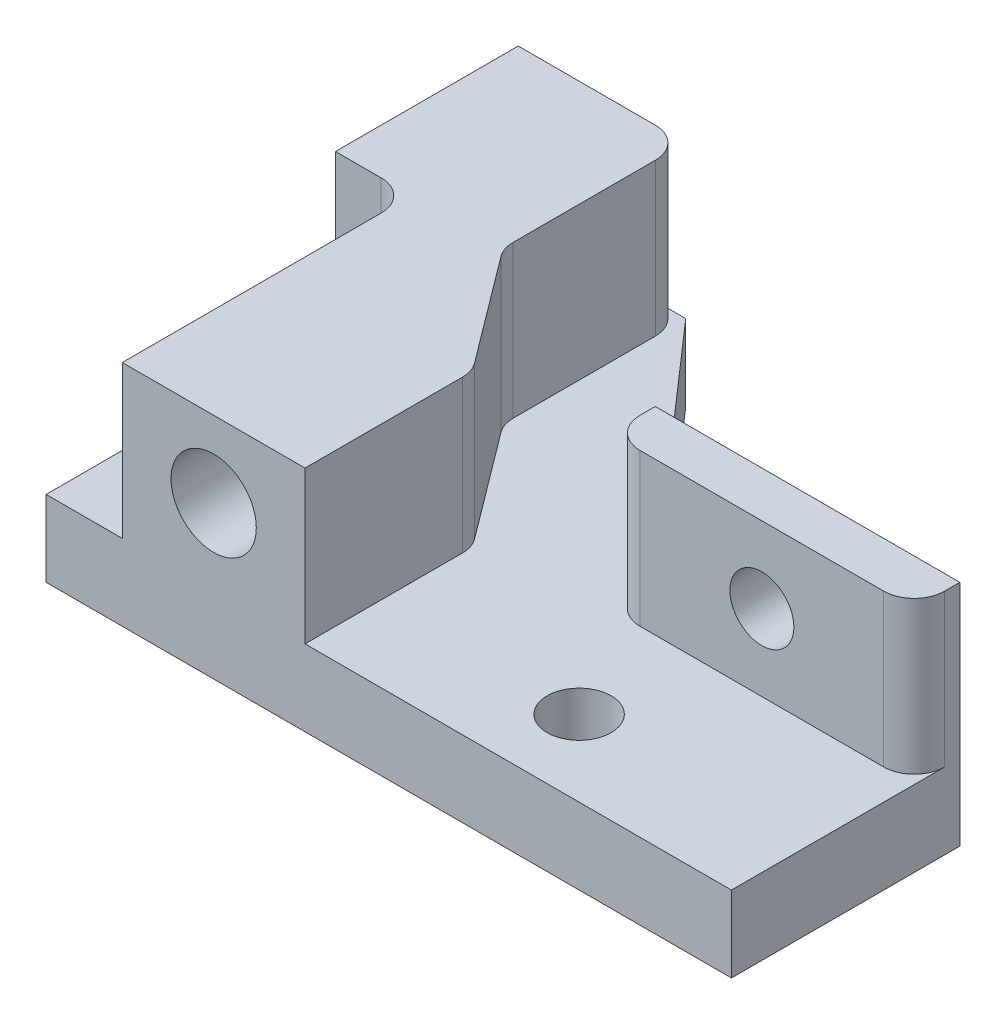
ISO-10303-21;
HEADER;
FILE_DESCRIPTION(('STEP AP214'),'2;1');
FILE_NAME('part.step','',(''),(''),'','','');
FILE_SCHEMA(('AUTOMOTIVE_DESIGN { 1 0 10303 214 1 1 1 1 }'));
ENDSEC;
DATA;
#1=APPLICATION_CONTEXT('core data for automotive mechanical design processes');
#2=APPLICATION_PROTOCOL_DEFINITION('international standard','automotive_design',2000,#1);
#3=PRODUCT_CONTEXT('',#1,'mechanical');
#4=PRODUCT('Part','Part','',(#3));
#5=PRODUCT_RELATED_PRODUCT_CATEGORY('part','',(#4));
#6=PRODUCT_DEFINITION_FORMATION('','',#4);
#7=PRODUCT_DEFINITION_CONTEXT('part definition',#1,'design');
#8=PRODUCT_DEFINITION('design','',#6,#7);
#9=PRODUCT_DEFINITION_SHAPE('','',#8);
#10=(LENGTH_UNIT() NAMED_UNIT(*) SI_UNIT(.MILLI.,.METRE.));
#11=(NAMED_UNIT(*) PLANE_ANGLE_UNIT() SI_UNIT($,.RADIAN.));
#12=(NAMED_UNIT(*) SI_UNIT($,.STERADIAN.) SOLID_ANGLE_UNIT());
#13=UNCERTAINTY_MEASURE_WITH_UNIT(LENGTH_MEASURE(1.E-05),#10,'distance_accuracy_value','');
#14=(GEOMETRIC_REPRESENTATION_CONTEXT(3) GLOBAL_UNCERTAINTY_ASSIGNED_CONTEXT((#13)) GLOBAL_UNIT_ASSIGNED_CONTEXT((#10,
#11,#12)) REPRESENTATION_CONTEXT('',''));
#15=CARTESIAN_POINT('',(0.,0.,0.));
#16=DIRECTION('',(0.,0.,1.));
#17=DIRECTION('',(1.,0.,0.));
#18=AXIS2_PLACEMENT_3D('',#15,#16,#17);
#19=CARTESIAN_POINT('',(0.,5.,0.));
#20=DIRECTION('',(0.,1.,0.));
#21=DIRECTION('',(0.,0.,1.));
#22=AXIS2_PLACEMENT_3D('',#19,#20,#21);
#23=PLANE('',#22);
#24=DIRECTION('',(0.,0.,-1.));
#25=VECTOR('',#24,1.);
#26=CARTESIAN_POINT('',(-20.,5.,0.));
#27=LINE('',#26,#25);
#28=CARTESIAN_POINT('',(-20.,5.,15.));
#29=VERTEX_POINT('',#28);
#30=CARTESIAN_POINT('',(-20.,5.,-1.99999999999999));
#31=VERTEX_POINT('',#30);
#32=EDGE_CURVE('E190',#29,#31,#27,.T.);
#33=ORIENTED_EDGE('',*,*,#32,.T.);
#34=CARTESIAN_POINT('',(-22.,5.,-1.99999999999999));
#35=DIRECTION('',(0.,1.,0.));
#36=DIRECTION('',(0.,0.,1.));
#37=AXIS2_PLACEMENT_3D('',#34,#35,#36);
#38=CIRCLE('',#37,2.);
#39=CARTESIAN_POINT('',(-22.,5.,-3.99999999999999));
#40=VERTEX_POINT('',#39);
#41=EDGE_CURVE('E325',#31,#40,#38,.T.);
#42=ORIENTED_EDGE('',*,*,#41,.T.);
#43=DIRECTION('',(-1.,0.,0.));
#44=VECTOR('',#43,1.);
#45=CARTESIAN_POINT('',(0.,5.,-4.));
#46=LINE('',#45,#44);
#47=CARTESIAN_POINT('',(-25.,5.,-3.99999999999999));
#48=VERTEX_POINT('',#47);
#49=EDGE_CURVE('E230',#40,#48,#46,.T.);
#50=ORIENTED_EDGE('',*,*,#49,.T.);
#51=DIRECTION('',(0.,0.,1.));
#52=VECTOR('',#51,1.);
#53=CARTESIAN_POINT('',(-25.,5.,-16.));
#54=LINE('',#53,#52);
#55=CARTESIAN_POINT('',(-25.,5.,15.));
#56=VERTEX_POINT('',#55);
#57=EDGE_CURVE('E271',#48,#56,#54,.T.);
#58=ORIENTED_EDGE('',*,*,#57,.T.);
#59=DIRECTION('',(1.,0.,0.));
#60=VECTOR('',#59,1.);
#61=CARTESIAN_POINT('',(-25.,5.,15.));
#62=LINE('',#61,#60);
#63=EDGE_CURVE('E275',#56,#29,#62,.T.);
#64=ORIENTED_EDGE('',*,*,#63,.T.);
#65=EDGE_LOOP('',(#33,#42,#50,#58,#64));
#66=FACE_BOUND('',#65,.T.);
#67=ADVANCED_FACE('F37',(#66),#23,.T.);
#68=DIRECTION('',(0.,0.,1.));
#69=VECTOR('',#68,1.);
#70=CARTESIAN_POINT('',(-14.,5.,0.));
#71=LINE('',#70,#69);
#72=CARTESIAN_POINT('',(-14.,5.,-14.));
#73=VERTEX_POINT('',#72);
#74=CARTESIAN_POINT('',(-14.,5.,-4.66666666666666));
#75=VERTEX_POINT('',#74);
#76=EDGE_CURVE('E213',#73,#75,#71,.T.);
#77=ORIENTED_EDGE('',*,*,#76,.T.);
#78=CARTESIAN_POINT('',(-12.,5.,-4.66666666666666));
#79=DIRECTION('',(0.,1.,0.));
#80=DIRECTION('',(0.,0.,1.));
#81=AXIS2_PLACEMENT_3D('',#78,#79,#80);
#82=CIRCLE('',#81,2.);
#83=CARTESIAN_POINT('',(-13.6,5.,-3.46666666666666));
#84=VERTEX_POINT('',#83);
#85=EDGE_CURVE('E349',#75,#84,#82,.T.);
#86=ORIENTED_EDGE('',*,*,#85,.T.);
#87=DIRECTION('',(0.6,0.,0.8));
#88=VECTOR('',#87,1.);
#89=CARTESIAN_POINT('',(-7.04,5.,5.28));
#90=LINE('',#89,#88);
#91=CARTESIAN_POINT('',(-8.4,5.,3.46666666666667));
#92=VERTEX_POINT('',#91);
#93=EDGE_CURVE('E236',#84,#92,#90,.T.);
#94=ORIENTED_EDGE('',*,*,#93,.T.);
#95=CARTESIAN_POINT('',(-9.99999999999999,5.,4.66666666666667));
#96=DIRECTION('',(0.,1.,0.));
#97=DIRECTION('',(0.,0.,1.));
#98=AXIS2_PLACEMENT_3D('',#95,#96,#97);
#99=CIRCLE('',#98,2.);
#100=CARTESIAN_POINT('',(-8.,5.,4.66666666666667));
#101=VERTEX_POINT('',#100);
#102=EDGE_CURVE('E45',#92,#101,#99,.F.);
#103=ORIENTED_EDGE('',*,*,#102,.T.);
#104=DIRECTION('',(0.,0.,1.));
#105=VECTOR('',#104,1.);
#106=CARTESIAN_POINT('',(-8.,5.,0.));
#107=LINE('',#106,#105);
#108=CARTESIAN_POINT('',(-8.,5.,15.));
#109=VERTEX_POINT('',#108);
#110=EDGE_CURVE('E234',#101,#109,#107,.T.);
#111=ORIENTED_EDGE('',*,*,#110,.T.);
#112=CARTESIAN_POINT('',(20.,5.,15.));
#113=VERTEX_POINT('',#112);
#114=EDGE_CURVE('E274',#109,#113,#62,.T.);
#115=ORIENTED_EDGE('',*,*,#114,.T.);
#116=DIRECTION('',(0.,0.,-1.));
#117=VECTOR('',#116,1.);
#118=CARTESIAN_POINT('',(20.,5.,0.));
#119=LINE('',#118,#117);
#120=CARTESIAN_POINT('',(20.,5.,0.999999999999999));
#121=VERTEX_POINT('',#120);
#122=EDGE_CURVE('E277',#113,#121,#119,.T.);
#123=ORIENTED_EDGE('',*,*,#122,.T.);
#124=CARTESIAN_POINT('',(18.,5.,1.));
#125=DIRECTION('',(0.,1.,0.));
#126=DIRECTION('',(0.,0.,1.));
#127=AXIS2_PLACEMENT_3D('',#124,#125,#126);
#128=CIRCLE('',#127,2.);
#129=CARTESIAN_POINT('',(18.,5.,3.));
#130=VERTEX_POINT('',#129);
#131=EDGE_CURVE('E351',#121,#130,#128,.F.);
#132=ORIENTED_EDGE('',*,*,#131,.T.);
#133=DIRECTION('',(1.,0.,0.));
#134=VECTOR('',#133,1.);
#135=CARTESIAN_POINT('',(0.,5.,3.));
#136=LINE('',#135,#134);
#137=CARTESIAN_POINT('',(2.,5.,3.));
#138=VERTEX_POINT('',#137);
#139=EDGE_CURVE('E247',#138,#130,#136,.T.);
#140=ORIENTED_EDGE('',*,*,#139,.F.);
#141=CARTESIAN_POINT('',(2.,5.,1.));
#142=DIRECTION('',(0.,1.,0.));
#143=DIRECTION('',(0.,0.,1.));
#144=AXIS2_PLACEMENT_3D('',#141,#142,#143);
#145=CIRCLE('',#144,2.);
#146=CARTESIAN_POINT('',(0.,5.,1.));
#147=VERTEX_POINT('',#146);
#148=EDGE_CURVE('E353',#138,#147,#145,.F.);
#149=ORIENTED_EDGE('',*,*,#148,.T.);
#150=DIRECTION('',(0.,0.,1.));
#151=VECTOR('',#150,1.);
#152=CARTESIAN_POINT('',(0.,5.,0.));
#153=LINE('',#152,#151);
#154=CARTESIAN_POINT('',(0.,5.,0.));
#155=VERTEX_POINT('',#154);
#156=EDGE_CURVE('E193',#155,#147,#153,.T.);
#157=ORIENTED_EDGE('',*,*,#156,.F.);
#158=DIRECTION('',(-0.658504607868518,0.,-0.752576694706878));
#159=VECTOR('',#158,1.);
#160=CARTESIAN_POINT('',(-14.,5.,-16.));
#161=LINE('',#160,#159);
#162=CARTESIAN_POINT('',(-14.,5.,-16.));
#163=VERTEX_POINT('',#162);
#164=EDGE_CURVE('E268',#155,#163,#161,.T.);
#165=ORIENTED_EDGE('',*,*,#164,.T.);
#166=DIRECTION('',(1.,0.,0.));
#167=VECTOR('',#166,1.);
#168=CARTESIAN_POINT('',(0.,5.,-16.));
#169=LINE('',#168,#167);
#170=CARTESIAN_POINT('',(-16.,5.,-16.));
#171=VERTEX_POINT('',#170);
#172=EDGE_CURVE('E329',#171,#163,#169,.T.);
#173=ORIENTED_EDGE('',*,*,#172,.F.);
#174=CARTESIAN_POINT('',(-16.,5.,-14.));
#175=DIRECTION('',(0.,1.,0.));
#176=DIRECTION('',(0.,0.,1.));
#177=AXIS2_PLACEMENT_3D('',#174,#175,#176);
#178=CIRCLE('',#177,2.);
#179=EDGE_CURVE('E356',#171,#73,#178,.F.);
#180=ORIENTED_EDGE('',*,*,#179,.T.);
#181=EDGE_LOOP('',(#77,#86,#94,#103,#111,#115,#123,#132,#140,#149,#157,#165,#173,#180));
#182=FACE_BOUND('',#181,.T.);
#183=CARTESIAN_POINT('',(5.,5.,10.));
#184=DIRECTION('',(0.,1.,0.));
#185=DIRECTION('',(0.,0.,1.));
#186=AXIS2_PLACEMENT_3D('',#183,#184,#185);
#187=CIRCLE('',#186,2.1);
#188=CARTESIAN_POINT('',(5.,5.,12.1));
#189=VERTEX_POINT('',#188);
#190=EDGE_CURVE('E262',#189,#189,#187,.T.);
#191=ORIENTED_EDGE('',*,*,#190,.F.);
#192=EDGE_LOOP('',(#191));
#193=FACE_BOUND('',#192,.T.);
#194=ADVANCED_FACE('F359',(#182,#193),#23,.T.);
#195=CARTESIAN_POINT('',(0.,0.,0.));
#196=DIRECTION('',(0.,1.,0.));
#197=DIRECTION('',(0.,0.,1.));
#198=AXIS2_PLACEMENT_3D('',#195,#196,#197);
#199=PLANE('',#198);
#200=DIRECTION('',(-0.658504607868518,0.,-0.752576694706878));
#201=VECTOR('',#200,1.);
#202=CARTESIAN_POINT('',(-14.,0.,-16.));
#203=LINE('',#202,#201);
#204=CARTESIAN_POINT('',(0.,0.,0.));
#205=VERTEX_POINT('',#204);
#206=CARTESIAN_POINT('',(-14.,0.,-16.));
#207=VERTEX_POINT('',#206);
#208=EDGE_CURVE('E265',#205,#207,#203,.T.);
#209=ORIENTED_EDGE('',*,*,#208,.F.);
#210=DIRECTION('',(-1.,0.,0.));
#211=VECTOR('',#210,1.);
#212=CARTESIAN_POINT('',(0.,0.,0.));
#213=LINE('',#212,#211);
#214=CARTESIAN_POINT('',(20.,0.,0.));
#215=VERTEX_POINT('',#214);
#216=EDGE_CURVE('E272',#215,#205,#213,.T.);
#217=ORIENTED_EDGE('',*,*,#216,.F.);
#218=DIRECTION('',(0.,0.,-1.));
#219=VECTOR('',#218,1.);
#220=CARTESIAN_POINT('',(20.,0.,0.));
#221=LINE('',#220,#219);
#222=CARTESIAN_POINT('',(20.,0.,15.));
#223=VERTEX_POINT('',#222);
#224=EDGE_CURVE('E289',#223,#215,#221,.T.);
#225=ORIENTED_EDGE('',*,*,#224,.F.);
#226=DIRECTION('',(1.,0.,0.));
#227=VECTOR('',#226,1.);
#228=CARTESIAN_POINT('',(20.,0.,15.));
#229=LINE('',#228,#227);
#230=CARTESIAN_POINT('',(-25.,0.,15.));
#231=VERTEX_POINT('',#230);
#232=EDGE_CURVE('E287',#231,#223,#229,.T.);
#233=ORIENTED_EDGE('',*,*,#232,.F.);
#234=DIRECTION('',(0.,0.,1.));
#235=VECTOR('',#234,1.);
#236=CARTESIAN_POINT('',(-25.,0.,-16.));
#237=LINE('',#236,#235);
#238=CARTESIAN_POINT('',(-25.,0.,-16.));
#239=VERTEX_POINT('',#238);
#240=EDGE_CURVE('E284',#239,#231,#237,.T.);
#241=ORIENTED_EDGE('',*,*,#240,.F.);
#242=DIRECTION('',(-1.,0.,0.));
#243=VECTOR('',#242,1.);
#244=CARTESIAN_POINT('',(-25.,0.,-16.));
#245=LINE('',#244,#243);
#246=EDGE_CURVE('E282',#207,#239,#245,.T.);
#247=ORIENTED_EDGE('',*,*,#246,.F.);
#248=EDGE_LOOP('',(#209,#217,#225,#233,#241,#247));
#249=FACE_BOUND('',#248,.T.);
#250=CARTESIAN_POINT('',(5.,0.,10.));
#251=DIRECTION('',(0.,1.,0.));
#252=DIRECTION('',(0.,0.,1.));
#253=AXIS2_PLACEMENT_3D('',#250,#251,#252);
#254=CIRCLE('',#253,2.1);
#255=CARTESIAN_POINT('',(5.,0.,12.1));
#256=VERTEX_POINT('',#255);
#257=EDGE_CURVE('E261',#256,#256,#254,.T.);
#258=ORIENTED_EDGE('',*,*,#257,.T.);
#259=EDGE_LOOP('',(#258));
#260=FACE_BOUND('',#259,.T.);
#261=ADVANCED_FACE('F389',(#249,#260),#199,.F.);
#262=CARTESIAN_POINT('',(-14.,5.,-16.));
#263=DIRECTION('',(-0.752576694706878,0.,0.658504607868518));
#264=DIRECTION('',(0.658504607868518,0.,0.752576694706878));
#265=AXIS2_PLACEMENT_3D('',#262,#263,#264);
#266=PLANE('',#265);
#267=ORIENTED_EDGE('',*,*,#208,.T.);
#268=DIRECTION('',(0.,-1.,0.));
#269=VECTOR('',#268,1.);
#270=CARTESIAN_POINT('',(-14.,5.,-16.));
#271=LINE('',#270,#269);
#272=EDGE_CURVE('E306',#163,#207,#271,.T.);
#273=ORIENTED_EDGE('',*,*,#272,.F.);
#274=ORIENTED_EDGE('',*,*,#164,.F.);
#275=DIRECTION('',(0.,-1.,0.));
#276=VECTOR('',#275,1.);
#277=CARTESIAN_POINT('',(0.,5.,0.));
#278=LINE('',#277,#276);
#279=EDGE_CURVE('E279',#155,#205,#278,.T.);
#280=ORIENTED_EDGE('',*,*,#279,.T.);
#281=EDGE_LOOP('',(#267,#273,#274,#280));
#282=FACE_BOUND('',#281,.T.);
#283=ADVANCED_FACE('F442',(#282),#266,.F.);
#284=CARTESIAN_POINT('',(-25.,5.,-16.));
#285=DIRECTION('',(0.,0.,1.));
#286=DIRECTION('',(1.,0.,0.));
#287=AXIS2_PLACEMENT_3D('',#284,#285,#286);
#288=PLANE('',#287);
#289=DIRECTION('',(-1.,0.,0.));
#290=VECTOR('',#289,1.);
#291=CARTESIAN_POINT('',(0.,15.,-16.));
#292=LINE('',#291,#290);
#293=CARTESIAN_POINT('',(-16.,15.,-16.));
#294=VERTEX_POINT('',#293);
#295=CARTESIAN_POINT('',(-25.,15.,-16.));
#296=VERTEX_POINT('',#295);
#297=EDGE_CURVE('E224',#294,#296,#292,.T.);
#298=ORIENTED_EDGE('',*,*,#297,.F.);
#299=DIRECTION('',(0.,-1.,0.));
#300=VECTOR('',#299,1.);
#301=CARTESIAN_POINT('',(-16.,5.,-16.));
#302=LINE('',#301,#300);
#303=EDGE_CURVE('E331',#294,#171,#302,.T.);
#304=ORIENTED_EDGE('',*,*,#303,.T.);
#305=ORIENTED_EDGE('',*,*,#172,.T.);
#306=ORIENTED_EDGE('',*,*,#272,.T.);
#307=ORIENTED_EDGE('',*,*,#246,.T.);
#308=DIRECTION('',(0.,-1.,0.));
#309=VECTOR('',#308,1.);
#310=CARTESIAN_POINT('',(-25.,5.,-16.));
#311=LINE('',#310,#309);
#312=EDGE_CURVE('E303',#296,#239,#311,.T.);
#313=ORIENTED_EDGE('',*,*,#312,.F.);
#314=EDGE_LOOP('',(#298,#304,#305,#306,#307,#313));
#315=FACE_BOUND('',#314,.T.);
#316=ADVANCED_FACE('F372',(#315),#288,.F.);
#317=CARTESIAN_POINT('',(-25.,5.,-16.));
#318=DIRECTION('',(1.,0.,0.));
#319=DIRECTION('',(0.,0.,-1.));
#320=AXIS2_PLACEMENT_3D('',#317,#318,#319);
#321=PLANE('',#320);
#322=CARTESIAN_POINT('',(-25.,10.,-9.99999999999999));
#323=DIRECTION('',(-1.,0.,0.));
#324=DIRECTION('',(0.,0.,1.));
#325=AXIS2_PLACEMENT_3D('',#322,#323,#324);
#326=CIRCLE('',#325,2.8);
#327=CARTESIAN_POINT('',(-25.,10.,-7.19999999999999));
#328=VERTEX_POINT('',#327);
#329=EDGE_CURVE('E630',#328,#328,#326,.T.);
#330=ORIENTED_EDGE('',*,*,#329,.F.);
#331=EDGE_LOOP('',(#330));
#332=FACE_BOUND('',#331,.T.);
#333=ORIENTED_EDGE('',*,*,#240,.T.);
#334=DIRECTION('',(0.,-1.,0.));
#335=VECTOR('',#334,1.);
#336=CARTESIAN_POINT('',(-25.,5.,15.));
#337=LINE('',#336,#335);
#338=EDGE_CURVE('E300',#56,#231,#337,.T.);
#339=ORIENTED_EDGE('',*,*,#338,.F.);
#340=ORIENTED_EDGE('',*,*,#57,.F.);
#341=DIRECTION('',(0.,-1.,0.));
#342=VECTOR('',#341,1.);
#343=CARTESIAN_POINT('',(-25.,15.,-3.99999999999999));
#344=LINE('',#343,#342);
#345=CARTESIAN_POINT('',(-25.,15.,-3.99999999999999));
#346=VERTEX_POINT('',#345);
#347=EDGE_CURVE('E229',#346,#48,#344,.T.);
#348=ORIENTED_EDGE('',*,*,#347,.F.);
#349=DIRECTION('',(0.,0.,1.));
#350=VECTOR('',#349,1.);
#351=CARTESIAN_POINT('',(-25.,15.,0.));
#352=LINE('',#351,#350);
#353=EDGE_CURVE('E226',#296,#346,#352,.T.);
#354=ORIENTED_EDGE('',*,*,#353,.F.);
#355=ORIENTED_EDGE('',*,*,#312,.T.);
#356=EDGE_LOOP('',(#333,#339,#340,#348,#354,#355));
#357=FACE_BOUND('',#356,.T.);
#358=ADVANCED_FACE('F377',(#332,#357),#321,.F.);
#359=CARTESIAN_POINT('',(20.,5.,15.));
#360=DIRECTION('',(0.,0.,-1.));
#361=DIRECTION('',(-1.,0.,0.));
#362=AXIS2_PLACEMENT_3D('',#359,#360,#361);
#363=PLANE('',#362);
#364=CARTESIAN_POINT('',(-14.,10.,15.));
#365=DIRECTION('',(0.,0.,1.));
#366=DIRECTION('',(1.,0.,0.));
#367=AXIS2_PLACEMENT_3D('',#364,#365,#366);
#368=CIRCLE('',#367,2.8);
#369=CARTESIAN_POINT('',(-11.2,10.,15.));
#370=VERTEX_POINT('',#369);
#371=EDGE_CURVE('E620',#370,#370,#368,.T.);
#372=ORIENTED_EDGE('',*,*,#371,.F.);
#373=EDGE_LOOP('',(#372));
#374=FACE_BOUND('',#373,.T.);
#375=ORIENTED_EDGE('',*,*,#232,.T.);
#376=DIRECTION('',(0.,-1.,0.));
#377=VECTOR('',#376,1.);
#378=CARTESIAN_POINT('',(20.,5.,15.));
#379=LINE('',#378,#377);
#380=EDGE_CURVE('E297',#113,#223,#379,.T.);
#381=ORIENTED_EDGE('',*,*,#380,.F.);
#382=ORIENTED_EDGE('',*,*,#114,.F.);
#383=DIRECTION('',(0.,-1.,0.));
#384=VECTOR('',#383,1.);
#385=CARTESIAN_POINT('',(-8.,15.,15.));
#386=LINE('',#385,#384);
#387=CARTESIAN_POINT('',(-8.,15.,15.));
#388=VERTEX_POINT('',#387);
#389=EDGE_CURVE('E194',#388,#109,#386,.T.);
#390=ORIENTED_EDGE('',*,*,#389,.F.);
#391=DIRECTION('',(1.,0.,0.));
#392=VECTOR('',#391,1.);
#393=CARTESIAN_POINT('',(0.,15.,15.));
#394=LINE('',#393,#392);
#395=CARTESIAN_POINT('',(-20.,15.,15.));
#396=VERTEX_POINT('',#395);
#397=EDGE_CURVE('E198',#396,#388,#394,.T.);
#398=ORIENTED_EDGE('',*,*,#397,.F.);
#399=DIRECTION('',(0.,-1.,0.));
#400=VECTOR('',#399,1.);
#401=CARTESIAN_POINT('',(-20.,15.,15.));
#402=LINE('',#401,#400);
#403=EDGE_CURVE('E182',#396,#29,#402,.T.);
#404=ORIENTED_EDGE('',*,*,#403,.T.);
#405=ORIENTED_EDGE('',*,*,#63,.F.);
#406=ORIENTED_EDGE('',*,*,#338,.T.);
#407=EDGE_LOOP('',(#375,#381,#382,#390,#398,#404,#405,#406));
#408=FACE_BOUND('',#407,.T.);
#409=ADVANCED_FACE('F199',(#374,#408),#363,.F.);
#410=CARTESIAN_POINT('',(20.,5.,0.));
#411=DIRECTION('',(-1.,0.,0.));
#412=DIRECTION('',(0.,0.,1.));
#413=AXIS2_PLACEMENT_3D('',#410,#411,#412);
#414=PLANE('',#413);
#415=DIRECTION('',(0.,0.,-1.));
#416=VECTOR('',#415,1.);
#417=CARTESIAN_POINT('',(20.,15.,0.));
#418=LINE('',#417,#416);
#419=CARTESIAN_POINT('',(20.,15.,0.999999999999999));
#420=VERTEX_POINT('',#419);
#421=CARTESIAN_POINT('',(20.,15.,0.));
#422=VERTEX_POINT('',#421);
#423=EDGE_CURVE('E250',#420,#422,#418,.T.);
#424=ORIENTED_EDGE('',*,*,#423,.F.);
#425=DIRECTION('',(0.,-1.,0.));
#426=VECTOR('',#425,1.);
#427=CARTESIAN_POINT('',(20.,5.,0.999999999999999));
#428=LINE('',#427,#426);
#429=EDGE_CURVE('E309',#420,#121,#428,.T.);
#430=ORIENTED_EDGE('',*,*,#429,.T.);
#431=ORIENTED_EDGE('',*,*,#122,.F.);
#432=ORIENTED_EDGE('',*,*,#380,.T.);
#433=ORIENTED_EDGE('',*,*,#224,.T.);
#434=DIRECTION('',(0.,-1.,0.));
#435=VECTOR('',#434,1.);
#436=CARTESIAN_POINT('',(20.,5.,0.));
#437=LINE('',#436,#435);
#438=EDGE_CURVE('E294',#422,#215,#437,.T.);
#439=ORIENTED_EDGE('',*,*,#438,.F.);
#440=EDGE_LOOP('',(#424,#430,#431,#432,#433,#439));
#441=FACE_BOUND('',#440,.T.);
#442=ADVANCED_FACE('F396',(#441),#414,.F.);
#443=CARTESIAN_POINT('',(0.,5.,0.));
#444=DIRECTION('',(0.,0.,1.));
#445=DIRECTION('',(1.,0.,0.));
#446=AXIS2_PLACEMENT_3D('',#443,#444,#445);
#447=PLANE('',#446);
#448=CARTESIAN_POINT('',(10.,10.,0.));
#449=DIRECTION('',(0.,0.,1.));
#450=DIRECTION('',(1.,0.,0.));
#451=AXIS2_PLACEMENT_3D('',#448,#449,#450);
#452=CIRCLE('',#451,2.1);
#453=CARTESIAN_POINT('',(12.1,10.,0.));
#454=VERTEX_POINT('',#453);
#455=EDGE_CURVE('E621',#454,#454,#452,.T.);
#456=ORIENTED_EDGE('',*,*,#455,.T.);
#457=EDGE_LOOP('',(#456));
#458=FACE_BOUND('',#457,.T.);
#459=ORIENTED_EDGE('',*,*,#216,.T.);
#460=ORIENTED_EDGE('',*,*,#279,.F.);
#461=DIRECTION('',(0.,-1.,0.));
#462=VECTOR('',#461,1.);
#463=CARTESIAN_POINT('',(0.,15.,0.));
#464=LINE('',#463,#462);
#465=CARTESIAN_POINT('',(0.,15.,0.));
#466=VERTEX_POINT('',#465);
#467=EDGE_CURVE('E254',#466,#155,#464,.T.);
#468=ORIENTED_EDGE('',*,*,#467,.F.);
#469=DIRECTION('',(-1.,0.,0.));
#470=VECTOR('',#469,1.);
#471=CARTESIAN_POINT('',(0.,15.,0.));
#472=LINE('',#471,#470);
#473=EDGE_CURVE('E252',#422,#466,#472,.T.);
#474=ORIENTED_EDGE('',*,*,#473,.F.);
#475=ORIENTED_EDGE('',*,*,#438,.T.);
#476=EDGE_LOOP('',(#459,#460,#468,#474,#475));
#477=FACE_BOUND('',#476,.T.);
#478=ADVANCED_FACE('F400',(#458,#477),#447,.F.);
#479=CARTESIAN_POINT('',(5.,5.,10.));
#480=DIRECTION('',(0.,-1.,0.));
#481=DIRECTION('',(0.,0.,-1.));
#482=AXIS2_PLACEMENT_3D('',#479,#480,#481);
#483=CYLINDRICAL_SURFACE('',#482,2.1);
#484=ORIENTED_EDGE('',*,*,#190,.T.);
#485=EDGE_LOOP('',(#484));
#486=FACE_BOUND('',#485,.T.);
#487=ORIENTED_EDGE('',*,*,#257,.F.);
#488=EDGE_LOOP('',(#487));
#489=FACE_BOUND('',#488,.T.);
#490=ADVANCED_FACE('F424',(#486,#489),#483,.F.);
#491=CARTESIAN_POINT('',(0.,15.,0.));
#492=DIRECTION('',(1.,0.,0.));
#493=DIRECTION('',(0.,0.,-1.));
#494=AXIS2_PLACEMENT_3D('',#491,#492,#493);
#495=PLANE('',#494);
#496=ORIENTED_EDGE('',*,*,#156,.T.);
#497=DIRECTION('',(0.,-1.,0.));
#498=VECTOR('',#497,1.);
#499=CARTESIAN_POINT('',(0.,15.,1.));
#500=LINE('',#499,#498);
#501=CARTESIAN_POINT('',(0.,15.,1.));
#502=VERTEX_POINT('',#501);
#503=EDGE_CURVE('E321',#147,#502,#500,.F.);
#504=ORIENTED_EDGE('',*,*,#503,.T.);
#505=DIRECTION('',(0.,0.,1.));
#506=VECTOR('',#505,1.);
#507=CARTESIAN_POINT('',(0.,15.,0.));
#508=LINE('',#507,#506);
#509=EDGE_CURVE('E243',#466,#502,#508,.T.);
#510=ORIENTED_EDGE('',*,*,#509,.F.);
#511=ORIENTED_EDGE('',*,*,#467,.T.);
#512=EDGE_LOOP('',(#496,#504,#510,#511));
#513=FACE_BOUND('',#512,.T.);
#514=ADVANCED_FACE('F422',(#513),#495,.F.);
#515=CARTESIAN_POINT('',(0.,15.,3.));
#516=DIRECTION('',(0.,0.,-1.));
#517=DIRECTION('',(-1.,0.,0.));
#518=AXIS2_PLACEMENT_3D('',#515,#516,#517);
#519=PLANE('',#518);
#520=CARTESIAN_POINT('',(10.,10.,3.));
#521=DIRECTION('',(0.,0.,1.));
#522=DIRECTION('',(1.,0.,0.));
#523=AXIS2_PLACEMENT_3D('',#520,#521,#522);
#524=CIRCLE('',#523,2.1);
#525=CARTESIAN_POINT('',(12.1,10.,3.));
#526=VERTEX_POINT('',#525);
#527=EDGE_CURVE('E624',#526,#526,#524,.T.);
#528=ORIENTED_EDGE('',*,*,#527,.F.);
#529=EDGE_LOOP('',(#528));
#530=FACE_BOUND('',#529,.T.);
#531=ORIENTED_EDGE('',*,*,#139,.T.);
#532=DIRECTION('',(0.,-1.,0.));
#533=VECTOR('',#532,1.);
#534=CARTESIAN_POINT('',(18.,15.,3.));
#535=LINE('',#534,#533);
#536=CARTESIAN_POINT('',(18.,15.,3.));
#537=VERTEX_POINT('',#536);
#538=EDGE_CURVE('E315',#130,#537,#535,.F.);
#539=ORIENTED_EDGE('',*,*,#538,.T.);
#540=DIRECTION('',(1.,0.,0.));
#541=VECTOR('',#540,1.);
#542=CARTESIAN_POINT('',(0.,15.,3.));
#543=LINE('',#542,#541);
#544=CARTESIAN_POINT('',(2.,15.,3.));
#545=VERTEX_POINT('',#544);
#546=EDGE_CURVE('E246',#545,#537,#543,.T.);
#547=ORIENTED_EDGE('',*,*,#546,.F.);
#548=DIRECTION('',(0.,-1.,0.));
#549=VECTOR('',#548,1.);
#550=CARTESIAN_POINT('',(2.,15.,3.));
#551=LINE('',#550,#549);
#552=EDGE_CURVE('E312',#545,#138,#551,.T.);
#553=ORIENTED_EDGE('',*,*,#552,.T.);
#554=EDGE_LOOP('',(#531,#539,#547,#553));
#555=FACE_BOUND('',#554,.T.);
#556=ADVANCED_FACE('F415',(#530,#555),#519,.F.);
#557=CARTESIAN_POINT('',(0.,15.,0.));
#558=DIRECTION('',(0.,1.,0.));
#559=DIRECTION('',(0.,0.,1.));
#560=AXIS2_PLACEMENT_3D('',#557,#558,#559);
#561=PLANE('',#560);
#562=ORIENTED_EDGE('',*,*,#546,.T.);
#563=CARTESIAN_POINT('',(18.,15.,1.));
#564=DIRECTION('',(0.,1.,0.));
#565=DIRECTION('',(0.,0.,1.));
#566=AXIS2_PLACEMENT_3D('',#563,#564,#565);
#567=CIRCLE('',#566,2.);
#568=EDGE_CURVE('E319',#537,#420,#567,.T.);
#569=ORIENTED_EDGE('',*,*,#568,.T.);
#570=ORIENTED_EDGE('',*,*,#423,.T.);
#571=ORIENTED_EDGE('',*,*,#473,.T.);
#572=ORIENTED_EDGE('',*,*,#509,.T.);
#573=CARTESIAN_POINT('',(2.,15.,1.));
#574=DIRECTION('',(0.,1.,0.));
#575=DIRECTION('',(0.,0.,1.));
#576=AXIS2_PLACEMENT_3D('',#573,#574,#575);
#577=CIRCLE('',#576,2.);
#578=EDGE_CURVE('E317',#502,#545,#577,.T.);
#579=ORIENTED_EDGE('',*,*,#578,.T.);
#580=EDGE_LOOP('',(#562,#569,#570,#571,#572,#579));
#581=FACE_BOUND('',#580,.T.);
#582=ADVANCED_FACE('F405',(#581),#561,.T.);
#583=CARTESIAN_POINT('',(0.,15.,-4.));
#584=DIRECTION('',(0.,0.,1.));
#585=DIRECTION('',(1.,0.,0.));
#586=AXIS2_PLACEMENT_3D('',#583,#584,#585);
#587=PLANE('',#586);
#588=ORIENTED_EDGE('',*,*,#49,.F.);
#589=DIRECTION('',(0.,-1.,0.));
#590=VECTOR('',#589,1.);
#591=CARTESIAN_POINT('',(-22.,15.,-3.99999999999999));
#592=LINE('',#591,#590);
#593=CARTESIAN_POINT('',(-22.,15.,-3.99999999999999));
#594=VERTEX_POINT('',#593);
#595=EDGE_CURVE('E327',#40,#594,#592,.F.);
#596=ORIENTED_EDGE('',*,*,#595,.T.);
#597=DIRECTION('',(-1.,0.,0.));
#598=VECTOR('',#597,1.);
#599=CARTESIAN_POINT('',(0.,15.,-4.));
#600=LINE('',#599,#598);
#601=EDGE_CURVE('E211',#594,#346,#600,.T.);
#602=ORIENTED_EDGE('',*,*,#601,.T.);
#603=ORIENTED_EDGE('',*,*,#347,.T.);
#604=EDGE_LOOP('',(#588,#596,#602,#603));
#605=FACE_BOUND('',#604,.T.);
#606=ADVANCED_FACE('F495',(#605),#587,.T.);
#607=CARTESIAN_POINT('',(-20.,15.,0.));
#608=DIRECTION('',(-1.,0.,0.));
#609=DIRECTION('',(0.,0.,1.));
#610=AXIS2_PLACEMENT_3D('',#607,#608,#609);
#611=PLANE('',#610);
#612=DIRECTION('',(0.,0.,-1.));
#613=VECTOR('',#612,1.);
#614=CARTESIAN_POINT('',(-20.,15.,0.));
#615=LINE('',#614,#613);
#616=CARTESIAN_POINT('',(-20.,15.,-1.99999999999999));
#617=VERTEX_POINT('',#616);
#618=EDGE_CURVE('E187',#396,#617,#615,.T.);
#619=ORIENTED_EDGE('',*,*,#618,.T.);
#620=DIRECTION('',(0.,-1.,0.));
#621=VECTOR('',#620,1.);
#622=CARTESIAN_POINT('',(-20.,5.,-1.99999999999999));
#623=LINE('',#622,#621);
#624=EDGE_CURVE('E323',#617,#31,#623,.T.);
#625=ORIENTED_EDGE('',*,*,#624,.T.);
#626=ORIENTED_EDGE('',*,*,#32,.F.);
#627=ORIENTED_EDGE('',*,*,#403,.F.);
#628=EDGE_LOOP('',(#619,#625,#626,#627));
#629=FACE_BOUND('',#628,.T.);
#630=ADVANCED_FACE('F184',(#629),#611,.T.);
#631=CARTESIAN_POINT('',(-8.,15.,0.));
#632=DIRECTION('',(1.,0.,0.));
#633=DIRECTION('',(0.,0.,-1.));
#634=AXIS2_PLACEMENT_3D('',#631,#632,#633);
#635=PLANE('',#634);
#636=ORIENTED_EDGE('',*,*,#110,.F.);
#637=DIRECTION('',(0.,-1.,0.));
#638=VECTOR('',#637,1.);
#639=CARTESIAN_POINT('',(-8.,15.,4.66666666666667));
#640=LINE('',#639,#638);
#641=CARTESIAN_POINT('',(-8.,15.,4.66666666666667));
#642=VERTEX_POINT('',#641);
#643=EDGE_CURVE('E347',#101,#642,#640,.F.);
#644=ORIENTED_EDGE('',*,*,#643,.T.);
#645=DIRECTION('',(0.,0.,1.));
#646=VECTOR('',#645,1.);
#647=CARTESIAN_POINT('',(-8.,15.,0.));
#648=LINE('',#647,#646);
#649=EDGE_CURVE('E204',#642,#388,#648,.T.);
#650=ORIENTED_EDGE('',*,*,#649,.T.);
#651=ORIENTED_EDGE('',*,*,#389,.T.);
#652=EDGE_LOOP('',(#636,#644,#650,#651));
#653=FACE_BOUND('',#652,.T.);
#654=ADVANCED_FACE('F482',(#653),#635,.T.);
#655=CARTESIAN_POINT('',(-7.04,15.,5.28));
#656=DIRECTION('',(0.8,0.,-0.6));
#657=DIRECTION('',(-0.6,0.,-0.8));
#658=AXIS2_PLACEMENT_3D('',#655,#656,#657);
#659=PLANE('',#658);
#660=DIRECTION('',(0.6,0.,0.8));
#661=VECTOR('',#660,1.);
#662=CARTESIAN_POINT('',(-7.04,15.,5.28));
#663=LINE('',#662,#661);
#664=CARTESIAN_POINT('',(-13.6,15.,-3.46666666666666));
#665=VERTEX_POINT('',#664);
#666=CARTESIAN_POINT('',(-8.4,15.,3.46666666666667));
#667=VERTEX_POINT('',#666);
#668=EDGE_CURVE('E218',#665,#667,#663,.T.);
#669=ORIENTED_EDGE('',*,*,#668,.T.);
#670=DIRECTION('',(0.,-1.,0.));
#671=VECTOR('',#670,1.);
#672=CARTESIAN_POINT('',(-8.4,15.,3.46666666666667));
#673=LINE('',#672,#671);
#674=EDGE_CURVE('E345',#667,#92,#673,.T.);
#675=ORIENTED_EDGE('',*,*,#674,.T.);
#676=ORIENTED_EDGE('',*,*,#93,.F.);
#677=DIRECTION('',(0.,-1.,0.));
#678=VECTOR('',#677,1.);
#679=CARTESIAN_POINT('',(-13.6,15.,-3.46666666666666));
#680=LINE('',#679,#678);
#681=EDGE_CURVE('E343',#84,#665,#680,.F.);
#682=ORIENTED_EDGE('',*,*,#681,.T.);
#683=EDGE_LOOP('',(#669,#675,#676,#682));
#684=FACE_BOUND('',#683,.T.);
#685=ADVANCED_FACE('F478',(#684),#659,.T.);
#686=CARTESIAN_POINT('',(-14.,15.,0.));
#687=DIRECTION('',(1.,0.,0.));
#688=DIRECTION('',(0.,0.,-1.));
#689=AXIS2_PLACEMENT_3D('',#686,#687,#688);
#690=PLANE('',#689);
#691=ORIENTED_EDGE('',*,*,#76,.F.);
#692=DIRECTION('',(0.,-1.,0.));
#693=VECTOR('',#692,1.);
#694=CARTESIAN_POINT('',(-14.,15.,-14.));
#695=LINE('',#694,#693);
#696=CARTESIAN_POINT('',(-14.,15.,-14.));
#697=VERTEX_POINT('',#696);
#698=EDGE_CURVE('E337',#73,#697,#695,.F.);
#699=ORIENTED_EDGE('',*,*,#698,.T.);
#700=DIRECTION('',(0.,0.,1.));
#701=VECTOR('',#700,1.);
#702=CARTESIAN_POINT('',(-14.,15.,0.));
#703=LINE('',#702,#701);
#704=CARTESIAN_POINT('',(-14.,15.,-4.66666666666666));
#705=VERTEX_POINT('',#704);
#706=EDGE_CURVE('E221',#697,#705,#703,.T.);
#707=ORIENTED_EDGE('',*,*,#706,.T.);
#708=DIRECTION('',(0.,-1.,0.));
#709=VECTOR('',#708,1.);
#710=CARTESIAN_POINT('',(-14.,5.,-4.66666666666666));
#711=LINE('',#710,#709);
#712=EDGE_CURVE('E334',#705,#75,#711,.T.);
#713=ORIENTED_EDGE('',*,*,#712,.T.);
#714=EDGE_LOOP('',(#691,#699,#707,#713));
#715=FACE_BOUND('',#714,.T.);
#716=ADVANCED_FACE('F365',(#715),#690,.T.);
#717=CARTESIAN_POINT('',(0.,15.,0.));
#718=DIRECTION('',(0.,1.,0.));
#719=DIRECTION('',(0.,0.,1.));
#720=AXIS2_PLACEMENT_3D('',#717,#718,#719);
#721=PLANE('',#720);
#722=ORIENTED_EDGE('',*,*,#706,.F.);
#723=CARTESIAN_POINT('',(-16.,15.,-14.));
#724=DIRECTION('',(0.,1.,0.));
#725=DIRECTION('',(0.,0.,1.));
#726=AXIS2_PLACEMENT_3D('',#723,#724,#725);
#727=CIRCLE('',#726,2.);
#728=EDGE_CURVE('E341',#697,#294,#727,.T.);
#729=ORIENTED_EDGE('',*,*,#728,.T.);
#730=ORIENTED_EDGE('',*,*,#297,.T.);
#731=ORIENTED_EDGE('',*,*,#353,.T.);
#732=ORIENTED_EDGE('',*,*,#601,.F.);
#733=CARTESIAN_POINT('',(-22.,15.,-1.99999999999999));
#734=DIRECTION('',(0.,1.,0.));
#735=DIRECTION('',(0.,0.,1.));
#736=AXIS2_PLACEMENT_3D('',#733,#734,#735);
#737=CIRCLE('',#736,2.);
#738=EDGE_CURVE('E210',#594,#617,#737,.F.);
#739=ORIENTED_EDGE('',*,*,#738,.T.);
#740=ORIENTED_EDGE('',*,*,#618,.F.);
#741=ORIENTED_EDGE('',*,*,#397,.T.);
#742=ORIENTED_EDGE('',*,*,#649,.F.);
#743=CARTESIAN_POINT('',(-9.99999999999999,15.,4.66666666666667));
#744=DIRECTION('',(0.,1.,0.));
#745=DIRECTION('',(0.,0.,1.));
#746=AXIS2_PLACEMENT_3D('',#743,#744,#745);
#747=CIRCLE('',#746,2.);
#748=EDGE_CURVE('E339',#642,#667,#747,.T.);
#749=ORIENTED_EDGE('',*,*,#748,.T.);
#750=ORIENTED_EDGE('',*,*,#668,.F.);
#751=CARTESIAN_POINT('',(-12.,15.,-4.66666666666666));
#752=DIRECTION('',(0.,1.,0.));
#753=DIRECTION('',(0.,0.,1.));
#754=AXIS2_PLACEMENT_3D('',#751,#752,#753);
#755=CIRCLE('',#754,2.);
#756=EDGE_CURVE('E11',#665,#705,#755,.F.);
#757=ORIENTED_EDGE('',*,*,#756,.T.);
#758=EDGE_LOOP('',(#722,#729,#730,#731,#732,#739,#740,#741,#742,#749,#750,#757));
#759=FACE_BOUND('',#758,.T.);
#760=ADVANCED_FACE('F207',(#759),#721,.T.);
#761=CARTESIAN_POINT('',(-14.,10.,5.9));
#762=DIRECTION('',(0.,0.,1.));
#763=DIRECTION('',(1.,0.,0.));
#764=AXIS2_PLACEMENT_3D('',#761,#762,#763);
#765=CYLINDRICAL_SURFACE('',#764,2.8);
#766=CARTESIAN_POINT('',(-14.,10.,5.9));
#767=DIRECTION('',(0.,0.,1.));
#768=DIRECTION('',(1.,0.,0.));
#769=AXIS2_PLACEMENT_3D('',#766,#767,#768);
#770=CIRCLE('',#769,2.8);
#771=CARTESIAN_POINT('',(-11.2,10.,5.9));
#772=VERTEX_POINT('',#771);
#773=EDGE_CURVE('E232',#772,#772,#770,.T.);
#774=ORIENTED_EDGE('',*,*,#773,.F.);
#775=EDGE_LOOP('',(#774));
#776=FACE_BOUND('',#775,.T.);
#777=ORIENTED_EDGE('',*,*,#371,.T.);
#778=EDGE_LOOP('',(#777));
#779=FACE_BOUND('',#778,.T.);
#780=ADVANCED_FACE('F535',(#776,#779),#765,.F.);
#781=CARTESIAN_POINT('',(-14.,10.,5.9));
#782=DIRECTION('',(0.,0.,1.));
#783=DIRECTION('',(1.,0.,0.));
#784=AXIS2_PLACEMENT_3D('',#781,#782,#783);
#785=PLANE('',#784);
#786=ORIENTED_EDGE('',*,*,#773,.T.);
#787=EDGE_LOOP('',(#786));
#788=FACE_BOUND('',#787,.T.);
#789=ADVANCED_FACE('F607',(#788),#785,.T.);
#790=CARTESIAN_POINT('',(10.,10.,-6.1));
#791=DIRECTION('',(0.,0.,1.));
#792=DIRECTION('',(1.,0.,0.));
#793=AXIS2_PLACEMENT_3D('',#790,#791,#792);
#794=CYLINDRICAL_SURFACE('',#793,2.1);
#795=ORIENTED_EDGE('',*,*,#527,.T.);
#796=EDGE_LOOP('',(#795));
#797=FACE_BOUND('',#796,.T.);
#798=ORIENTED_EDGE('',*,*,#455,.F.);
#799=EDGE_LOOP('',(#798));
#800=FACE_BOUND('',#799,.T.);
#801=ADVANCED_FACE('F461',(#797,#800),#794,.F.);
#802=CARTESIAN_POINT('',(18.,5.,1.));
#803=DIRECTION('',(0.,-1.,0.));
#804=DIRECTION('',(0.,0.,-1.));
#805=AXIS2_PLACEMENT_3D('',#802,#803,#804);
#806=CYLINDRICAL_SURFACE('',#805,2.);
#807=ORIENTED_EDGE('',*,*,#568,.F.);
#808=ORIENTED_EDGE('',*,*,#538,.F.);
#809=ORIENTED_EDGE('',*,*,#131,.F.);
#810=ORIENTED_EDGE('',*,*,#429,.F.);
#811=EDGE_LOOP('',(#807,#808,#809,#810));
#812=FACE_BOUND('',#811,.T.);
#813=ADVANCED_FACE('F411',(#812),#806,.T.);
#814=CARTESIAN_POINT('',(2.,15.,1.));
#815=DIRECTION('',(0.,-1.,0.));
#816=DIRECTION('',(0.,0.,-1.));
#817=AXIS2_PLACEMENT_3D('',#814,#815,#816);
#818=CYLINDRICAL_SURFACE('',#817,2.);
#819=ORIENTED_EDGE('',*,*,#578,.F.);
#820=ORIENTED_EDGE('',*,*,#503,.F.);
#821=ORIENTED_EDGE('',*,*,#148,.F.);
#822=ORIENTED_EDGE('',*,*,#552,.F.);
#823=EDGE_LOOP('',(#819,#820,#821,#822));
#824=FACE_BOUND('',#823,.T.);
#825=ADVANCED_FACE('F419',(#824),#818,.T.);
#826=CARTESIAN_POINT('',(-22.,15.,-1.99999999999999));
#827=DIRECTION('',(0.,1.,0.));
#828=DIRECTION('',(0.,0.,1.));
#829=AXIS2_PLACEMENT_3D('',#826,#827,#828);
#830=CYLINDRICAL_SURFACE('',#829,2.);
#831=ORIENTED_EDGE('',*,*,#738,.F.);
#832=ORIENTED_EDGE('',*,*,#595,.F.);
#833=ORIENTED_EDGE('',*,*,#41,.F.);
#834=ORIENTED_EDGE('',*,*,#624,.F.);
#835=EDGE_LOOP('',(#831,#832,#833,#834));
#836=FACE_BOUND('',#835,.T.);
#837=ADVANCED_FACE('F382',(#836),#830,.F.);
#838=CARTESIAN_POINT('',(-16.,5.,-14.));
#839=DIRECTION('',(0.,1.,0.));
#840=DIRECTION('',(0.,0.,1.));
#841=AXIS2_PLACEMENT_3D('',#838,#839,#840);
#842=CYLINDRICAL_SURFACE('',#841,2.);
#843=ORIENTED_EDGE('',*,*,#728,.F.);
#844=ORIENTED_EDGE('',*,*,#698,.F.);
#845=ORIENTED_EDGE('',*,*,#179,.F.);
#846=ORIENTED_EDGE('',*,*,#303,.F.);
#847=EDGE_LOOP('',(#843,#844,#845,#846));
#848=FACE_BOUND('',#847,.T.);
#849=ADVANCED_FACE('F368',(#848),#842,.T.);
#850=CARTESIAN_POINT('',(-9.99999999999999,15.,4.66666666666667));
#851=DIRECTION('',(0.,-1.,0.));
#852=DIRECTION('',(0.,0.,-1.));
#853=AXIS2_PLACEMENT_3D('',#850,#851,#852);
#854=CYLINDRICAL_SURFACE('',#853,2.);
#855=ORIENTED_EDGE('',*,*,#748,.F.);
#856=ORIENTED_EDGE('',*,*,#643,.F.);
#857=ORIENTED_EDGE('',*,*,#102,.F.);
#858=ORIENTED_EDGE('',*,*,#674,.F.);
#859=EDGE_LOOP('',(#855,#856,#857,#858));
#860=FACE_BOUND('',#859,.T.);
#861=ADVANCED_FACE('F467',(#860),#854,.T.);
#862=CARTESIAN_POINT('',(-12.,15.,-4.66666666666666));
#863=DIRECTION('',(0.,1.,0.));
#864=DIRECTION('',(0.,0.,1.));
#865=AXIS2_PLACEMENT_3D('',#862,#863,#864);
#866=CYLINDRICAL_SURFACE('',#865,2.);
#867=ORIENTED_EDGE('',*,*,#756,.F.);
#868=ORIENTED_EDGE('',*,*,#681,.F.);
#869=ORIENTED_EDGE('',*,*,#85,.F.);
#870=ORIENTED_EDGE('',*,*,#712,.F.);
#871=EDGE_LOOP('',(#867,#868,#869,#870));
#872=FACE_BOUND('',#871,.T.);
#873=ADVANCED_FACE('F39',(#872),#866,.F.);
#874=CARTESIAN_POINT('',(-15.9,10.,-9.99999999999999));
#875=DIRECTION('',(-1.,0.,0.));
#876=DIRECTION('',(0.,0.,1.));
#877=AXIS2_PLACEMENT_3D('',#874,#875,#876);
#878=CYLINDRICAL_SURFACE('',#877,2.8);
#879=CARTESIAN_POINT('',(-15.9,10.,-9.99999999999999));
#880=DIRECTION('',(-1.,0.,0.));
#881=DIRECTION('',(0.,0.,1.));
#882=AXIS2_PLACEMENT_3D('',#879,#880,#881);
#883=CIRCLE('',#882,2.8);
#884=CARTESIAN_POINT('',(-15.9,10.,-7.19999999999999));
#885=VERTEX_POINT('',#884);
#886=EDGE_CURVE('E629',#885,#885,#883,.T.);
#887=ORIENTED_EDGE('',*,*,#886,.F.);
#888=EDGE_LOOP('',(#887));
#889=FACE_BOUND('',#888,.T.);
#890=ORIENTED_EDGE('',*,*,#329,.T.);
#891=EDGE_LOOP('',(#890));
#892=FACE_BOUND('',#891,.T.);
#893=ADVANCED_FACE('F472',(#889,#892),#878,.F.);
#894=CARTESIAN_POINT('',(-15.9,10.,-9.99999999999999));
#895=DIRECTION('',(-1.,0.,0.));
#896=DIRECTION('',(0.,0.,1.));
#897=AXIS2_PLACEMENT_3D('',#894,#895,#896);
#898=PLANE('',#897);
#899=ORIENTED_EDGE('',*,*,#886,.T.);
#900=EDGE_LOOP('',(#899));
#901=FACE_BOUND('',#900,.T.);
#902=ADVANCED_FACE('F590',(#901),#898,.T.);
#903=CLOSED_SHELL('',(#67,#194,#261,#283,#316,#358,#409,#442,#478,#490,#514,#556,#582,#606,#630,
#654,#685,#716,#760,#780,#789,#801,#813,#825,#837,#849,#861,#873,#893,#902));
#904=MANIFOLD_SOLID_BREP('B2',#903);
#905=ADVANCED_BREP_SHAPE_REPRESENTATION('',(#18,#904),#14);
#906=SHAPE_DEFINITION_REPRESENTATION(#9,#905);
ENDSEC;
END-ISO-10303-21;
